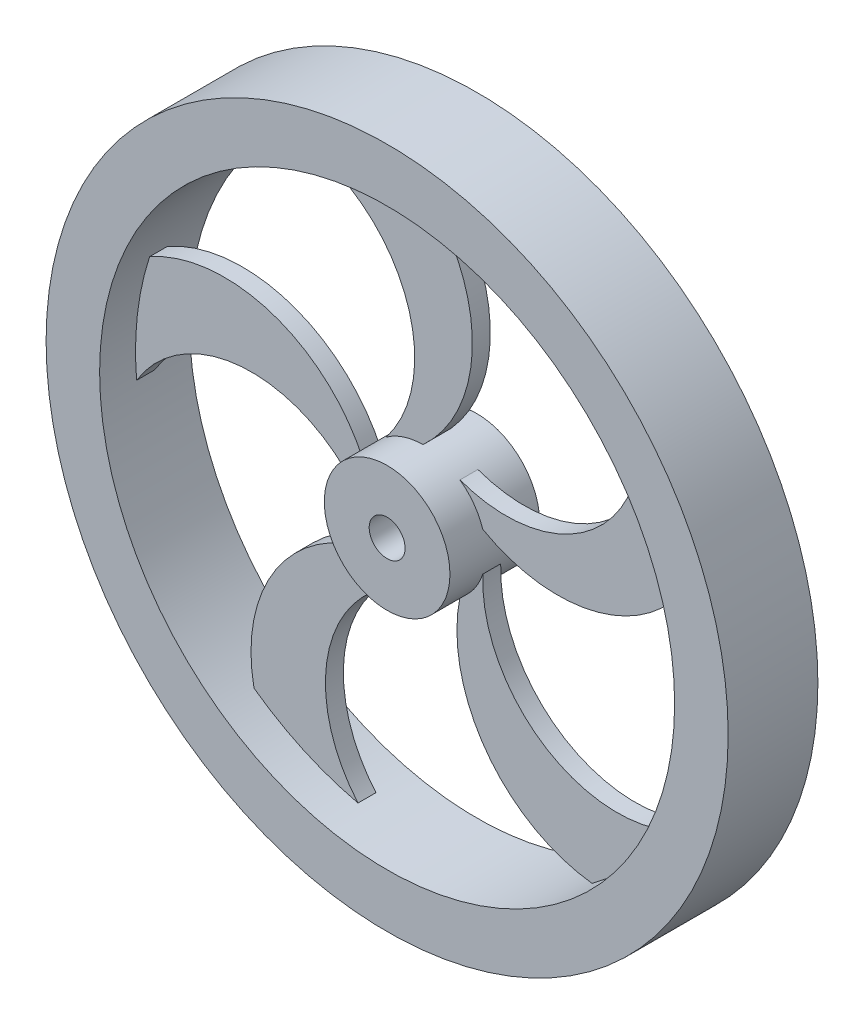
ISO-10303-21;
HEADER;
FILE_DESCRIPTION(('STEP AP214'),'2;1');
FILE_NAME('part.step','',(''),(''),'','','');
FILE_SCHEMA(('AUTOMOTIVE_DESIGN { 1 0 10303 214 1 1 1 1 }'));
ENDSEC;
DATA;
#1=APPLICATION_CONTEXT('core data for automotive mechanical design processes');
#2=APPLICATION_PROTOCOL_DEFINITION('international standard','automotive_design',2000,#1);
#3=PRODUCT_CONTEXT('',#1,'mechanical');
#4=PRODUCT('Part','Part','',(#3));
#5=PRODUCT_RELATED_PRODUCT_CATEGORY('part','',(#4));
#6=PRODUCT_DEFINITION_FORMATION('','',#4);
#7=PRODUCT_DEFINITION_CONTEXT('part definition',#1,'design');
#8=PRODUCT_DEFINITION('design','',#6,#7);
#9=PRODUCT_DEFINITION_SHAPE('','',#8);
#10=(LENGTH_UNIT() NAMED_UNIT(*) SI_UNIT(.MILLI.,.METRE.));
#11=(NAMED_UNIT(*) PLANE_ANGLE_UNIT() SI_UNIT($,.RADIAN.));
#12=(NAMED_UNIT(*) SI_UNIT($,.STERADIAN.) SOLID_ANGLE_UNIT());
#13=UNCERTAINTY_MEASURE_WITH_UNIT(LENGTH_MEASURE(1.E-05),#10,'distance_accuracy_value','');
#14=(GEOMETRIC_REPRESENTATION_CONTEXT(3) GLOBAL_UNCERTAINTY_ASSIGNED_CONTEXT((#13)) GLOBAL_UNIT_ASSIGNED_CONTEXT((#10,
#11,#12)) REPRESENTATION_CONTEXT('',''));
#15=CARTESIAN_POINT('',(0.,0.,0.));
#16=DIRECTION('',(0.,0.,1.));
#17=DIRECTION('',(1.,0.,0.));
#18=AXIS2_PLACEMENT_3D('',#15,#16,#17);
#19=CARTESIAN_POINT('',(0.,0.,5.));
#20=DIRECTION('',(0.,0.,-1.));
#21=DIRECTION('',(-1.,0.,0.));
#22=AXIS2_PLACEMENT_3D('',#19,#20,#21);
#23=CYLINDRICAL_SURFACE('',#22,32.0365194227107);
#24=CARTESIAN_POINT('',(0.,0.,1.));
#25=DIRECTION('',(0.,0.,1.));
#26=DIRECTION('',(1.,0.,0.));
#27=AXIS2_PLACEMENT_3D('',#24,#25,#26);
#28=CIRCLE('',#27,32.0365194227107);
#29=CARTESIAN_POINT('',(-18.830593651451,-25.9180886535959,1.));
#30=VERTEX_POINT('',#29);
#31=CARTESIAN_POINT('',(-7.24531851790362,-31.2064726666736,1.));
#32=VERTEX_POINT('',#31);
#33=EDGE_CURVE('E238',#30,#32,#28,.T.);
#34=ORIENTED_EDGE('',*,*,#33,.F.);
#35=DIRECTION('',(0.,0.,-1.));
#36=VECTOR('',#35,1.);
#37=CARTESIAN_POINT('',(-18.830593651451,-25.9180886535959,1.));
#38=LINE('',#37,#36);
#39=CARTESIAN_POINT('',(-18.830593651451,-25.9180886535959,-1.));
#40=VERTEX_POINT('',#39);
#41=EDGE_CURVE('E246',#30,#40,#38,.T.);
#42=ORIENTED_EDGE('',*,*,#41,.T.);
#43=CARTESIAN_POINT('',(0.,0.,-1.));
#44=DIRECTION('',(0.,0.,1.));
#45=DIRECTION('',(1.,0.,0.));
#46=AXIS2_PLACEMENT_3D('',#43,#44,#45);
#47=CIRCLE('',#46,32.0365194227107);
#48=CARTESIAN_POINT('',(-7.24531851790363,-31.2064726666736,-1.));
#49=VERTEX_POINT('',#48);
#50=EDGE_CURVE('E263',#40,#49,#47,.T.);
#51=ORIENTED_EDGE('',*,*,#50,.T.);
#52=DIRECTION('',(0.,0.,-1.));
#53=VECTOR('',#52,1.);
#54=CARTESIAN_POINT('',(-7.24531851790362,-31.2064726666736,1.));
#55=LINE('',#54,#53);
#56=EDGE_CURVE('E253',#32,#49,#55,.T.);
#57=ORIENTED_EDGE('',*,*,#56,.F.);
#58=EDGE_LOOP('',(#34,#42,#51,#57));
#59=FACE_BOUND('',#58,.T.);
#60=CARTESIAN_POINT('',(0.,0.,1.));
#61=DIRECTION('',(0.,0.,1.));
#62=DIRECTION('',(1.,0.,0.));
#63=AXIS2_PLACEMENT_3D('',#60,#61,#62);
#64=CIRCLE('',#63,32.0365194227107);
#65=CARTESIAN_POINT('',(18.8305936514506,-25.9180886535962,1.));
#66=VERTEX_POINT('',#65);
#67=CARTESIAN_POINT('',(27.4401926285348,-16.5340377775855,1.));
#68=VERTEX_POINT('',#67);
#69=EDGE_CURVE('E273',#66,#68,#64,.T.);
#70=ORIENTED_EDGE('',*,*,#69,.F.);
#71=DIRECTION('',(0.,0.,-1.));
#72=VECTOR('',#71,1.);
#73=CARTESIAN_POINT('',(18.8305936514506,-25.9180886535962,1.));
#74=LINE('',#73,#72);
#75=CARTESIAN_POINT('',(18.8305936514506,-25.9180886535962,-1.));
#76=VERTEX_POINT('',#75);
#77=EDGE_CURVE('E298',#66,#76,#74,.T.);
#78=ORIENTED_EDGE('',*,*,#77,.T.);
#79=CARTESIAN_POINT('',(0.,0.,-1.));
#80=DIRECTION('',(0.,0.,1.));
#81=DIRECTION('',(1.,0.,0.));
#82=AXIS2_PLACEMENT_3D('',#79,#80,#81);
#83=CIRCLE('',#82,32.0365194227107);
#84=CARTESIAN_POINT('',(27.4401926285348,-16.5340377775855,-1.));
#85=VERTEX_POINT('',#84);
#86=EDGE_CURVE('E284',#76,#85,#83,.T.);
#87=ORIENTED_EDGE('',*,*,#86,.T.);
#88=DIRECTION('',(0.,0.,-1.));
#89=VECTOR('',#88,1.);
#90=CARTESIAN_POINT('',(27.4401926285348,-16.5340377775855,1.));
#91=LINE('',#90,#89);
#92=EDGE_CURVE('E295',#68,#85,#91,.T.);
#93=ORIENTED_EDGE('',*,*,#92,.F.);
#94=EDGE_LOOP('',(#70,#78,#87,#93));
#95=FACE_BOUND('',#94,.T.);
#96=CARTESIAN_POINT('',(0.,0.,1.));
#97=DIRECTION('',(0.,0.,1.));
#98=DIRECTION('',(1.,0.,0.));
#99=AXIS2_PLACEMENT_3D('',#96,#97,#98);
#100=CIRCLE('',#99,32.0365194227107);
#101=CARTESIAN_POINT('',(30.4685405563853,9.89982894224061,1.));
#102=VERTEX_POINT('',#101);
#103=CARTESIAN_POINT('',(24.2042902201823,20.9878753488511,1.));
#104=VERTEX_POINT('',#103);
#105=EDGE_CURVE('E304',#102,#104,#100,.T.);
#106=ORIENTED_EDGE('',*,*,#105,.F.);
#107=DIRECTION('',(0.,0.,-1.));
#108=VECTOR('',#107,1.);
#109=CARTESIAN_POINT('',(30.4685405563853,9.89982894224061,1.));
#110=LINE('',#109,#108);
#111=CARTESIAN_POINT('',(30.4685405563853,9.89982894224061,-1.));
#112=VERTEX_POINT('',#111);
#113=EDGE_CURVE('E329',#102,#112,#110,.T.);
#114=ORIENTED_EDGE('',*,*,#113,.T.);
#115=CARTESIAN_POINT('',(0.,0.,-1.));
#116=DIRECTION('',(0.,0.,1.));
#117=DIRECTION('',(1.,0.,0.));
#118=AXIS2_PLACEMENT_3D('',#115,#116,#117);
#119=CIRCLE('',#118,32.0365194227107);
#120=CARTESIAN_POINT('',(24.2042902201823,20.987875348851,-1.));
#121=VERTEX_POINT('',#120);
#122=EDGE_CURVE('E315',#112,#121,#119,.T.);
#123=ORIENTED_EDGE('',*,*,#122,.T.);
#124=DIRECTION('',(0.,0.,-1.));
#125=VECTOR('',#124,1.);
#126=CARTESIAN_POINT('',(24.2042902201823,20.9878753488511,1.));
#127=LINE('',#126,#125);
#128=EDGE_CURVE('E326',#104,#121,#127,.T.);
#129=ORIENTED_EDGE('',*,*,#128,.F.);
#130=EDGE_LOOP('',(#106,#114,#123,#129));
#131=FACE_BOUND('',#130,.T.);
#132=CARTESIAN_POINT('',(0.,0.,1.));
#133=DIRECTION('',(0.,0.,1.));
#134=DIRECTION('',(1.,0.,0.));
#135=AXIS2_PLACEMENT_3D('',#132,#133,#134);
#136=CIRCLE('',#135,32.0365194227107);
#137=CARTESIAN_POINT('',(0.,32.0365194227108,1.));
#138=VERTEX_POINT('',#137);
#139=CARTESIAN_POINT('',(-12.4811185988956,29.5052580948214,1.));
#140=VERTEX_POINT('',#139);
#141=EDGE_CURVE('E335',#138,#140,#136,.T.);
#142=ORIENTED_EDGE('',*,*,#141,.F.);
#143=DIRECTION('',(0.,0.,-1.));
#144=VECTOR('',#143,1.);
#145=CARTESIAN_POINT('',(0.,32.0365194227108,1.));
#146=LINE('',#145,#144);
#147=CARTESIAN_POINT('',(0.,32.0365194227108,-1.));
#148=VERTEX_POINT('',#147);
#149=EDGE_CURVE('E360',#138,#148,#146,.T.);
#150=ORIENTED_EDGE('',*,*,#149,.T.);
#151=CARTESIAN_POINT('',(0.,0.,-1.));
#152=DIRECTION('',(0.,0.,1.));
#153=DIRECTION('',(1.,0.,0.));
#154=AXIS2_PLACEMENT_3D('',#151,#152,#153);
#155=CIRCLE('',#154,32.0365194227107);
#156=CARTESIAN_POINT('',(-12.4811185988956,29.5052580948214,-1.));
#157=VERTEX_POINT('',#156);
#158=EDGE_CURVE('E346',#148,#157,#155,.T.);
#159=ORIENTED_EDGE('',*,*,#158,.T.);
#160=DIRECTION('',(0.,0.,-1.));
#161=VECTOR('',#160,1.);
#162=CARTESIAN_POINT('',(-12.4811185988956,29.5052580948214,1.));
#163=LINE('',#162,#161);
#164=EDGE_CURVE('E357',#140,#157,#163,.T.);
#165=ORIENTED_EDGE('',*,*,#164,.F.);
#166=EDGE_LOOP('',(#142,#150,#159,#165));
#167=FACE_BOUND('',#166,.T.);
#168=CARTESIAN_POINT('',(0.,0.,1.));
#169=DIRECTION('',(0.,0.,1.));
#170=DIRECTION('',(1.,0.,0.));
#171=AXIS2_PLACEMENT_3D('',#168,#169,#170);
#172=CIRCLE('',#171,32.0365194227107);
#173=CARTESIAN_POINT('',(-30.4685405563852,9.89982894224105,1.));
#174=VERTEX_POINT('',#173);
#175=CARTESIAN_POINT('',(-31.9180457319183,-2.75262299941316,1.));
#176=VERTEX_POINT('',#175);
#177=EDGE_CURVE('E378',#174,#176,#172,.T.);
#178=ORIENTED_EDGE('',*,*,#177,.F.);
#179=DIRECTION('',(0.,0.,-1.));
#180=VECTOR('',#179,1.);
#181=CARTESIAN_POINT('',(-30.4685405563852,9.89982894224105,1.));
#182=LINE('',#181,#180);
#183=CARTESIAN_POINT('',(-30.4685405563852,9.89982894224105,-1.));
#184=VERTEX_POINT('',#183);
#185=EDGE_CURVE('E403',#174,#184,#182,.T.);
#186=ORIENTED_EDGE('',*,*,#185,.T.);
#187=CARTESIAN_POINT('',(0.,0.,-1.));
#188=DIRECTION('',(0.,0.,1.));
#189=DIRECTION('',(1.,0.,0.));
#190=AXIS2_PLACEMENT_3D('',#187,#188,#189);
#191=CIRCLE('',#190,32.0365194227107);
#192=CARTESIAN_POINT('',(-31.9180457319182,-2.75262299941315,-1.));
#193=VERTEX_POINT('',#192);
#194=EDGE_CURVE('E389',#184,#193,#191,.T.);
#195=ORIENTED_EDGE('',*,*,#194,.T.);
#196=DIRECTION('',(0.,0.,-1.));
#197=VECTOR('',#196,1.);
#198=CARTESIAN_POINT('',(-31.9180457319183,-2.75262299941316,1.));
#199=LINE('',#198,#197);
#200=EDGE_CURVE('E400',#176,#193,#199,.T.);
#201=ORIENTED_EDGE('',*,*,#200,.F.);
#202=EDGE_LOOP('',(#178,#186,#195,#201));
#203=FACE_BOUND('',#202,.T.);
#204=CARTESIAN_POINT('',(0.,0.,5.));
#205=DIRECTION('',(0.,0.,1.));
#206=DIRECTION('',(1.,0.,0.));
#207=AXIS2_PLACEMENT_3D('',#204,#205,#206);
#208=CIRCLE('',#207,32.0365194227107);
#209=CARTESIAN_POINT('',(32.0365194227107,0.,5.));
#210=VERTEX_POINT('',#209);
#211=EDGE_CURVE('E103',#210,#210,#208,.T.);
#212=ORIENTED_EDGE('',*,*,#211,.T.);
#213=EDGE_LOOP('',(#212));
#214=FACE_BOUND('',#213,.T.);
#215=CARTESIAN_POINT('',(0.,0.,-5.));
#216=DIRECTION('',(0.,0.,1.));
#217=DIRECTION('',(1.,0.,0.));
#218=AXIS2_PLACEMENT_3D('',#215,#216,#217);
#219=CIRCLE('',#218,32.0365194227107);
#220=CARTESIAN_POINT('',(32.0365194227107,0.,-5.));
#221=VERTEX_POINT('',#220);
#222=EDGE_CURVE('E406',#221,#221,#219,.T.);
#223=ORIENTED_EDGE('',*,*,#222,.F.);
#224=EDGE_LOOP('',(#223));
#225=FACE_BOUND('',#224,.T.);
#226=ADVANCED_FACE('F95',(#59,#95,#131,#167,#203,#214,#225),#23,.F.);
#227=CARTESIAN_POINT('',(0.,0.,5.));
#228=DIRECTION('',(0.,0.,-1.));
#229=DIRECTION('',(-1.,0.,0.));
#230=AXIS2_PLACEMENT_3D('',#227,#228,#229);
#231=CYLINDRICAL_SURFACE('',#230,38.);
#232=CARTESIAN_POINT('',(0.,0.,5.));
#233=DIRECTION('',(0.,0.,1.));
#234=DIRECTION('',(1.,0.,0.));
#235=AXIS2_PLACEMENT_3D('',#232,#233,#234);
#236=CIRCLE('',#235,38.);
#237=CARTESIAN_POINT('',(38.,0.,5.));
#238=VERTEX_POINT('',#237);
#239=EDGE_CURVE('E12',#238,#238,#236,.T.);
#240=ORIENTED_EDGE('',*,*,#239,.F.);
#241=EDGE_LOOP('',(#240));
#242=FACE_BOUND('',#241,.T.);
#243=CARTESIAN_POINT('',(0.,0.,-5.));
#244=DIRECTION('',(0.,0.,1.));
#245=DIRECTION('',(1.,0.,0.));
#246=AXIS2_PLACEMENT_3D('',#243,#244,#245);
#247=CIRCLE('',#246,38.);
#248=CARTESIAN_POINT('',(38.,0.,-5.));
#249=VERTEX_POINT('',#248);
#250=EDGE_CURVE('E98',#249,#249,#247,.T.);
#251=ORIENTED_EDGE('',*,*,#250,.T.);
#252=EDGE_LOOP('',(#251));
#253=FACE_BOUND('',#252,.T.);
#254=ADVANCED_FACE('F414',(#242,#253),#231,.T.);
#255=CARTESIAN_POINT('',(0.,0.,5.));
#256=DIRECTION('',(0.,0.,1.));
#257=DIRECTION('',(1.,0.,0.));
#258=AXIS2_PLACEMENT_3D('',#255,#256,#257);
#259=PLANE('',#258);
#260=ORIENTED_EDGE('',*,*,#211,.F.);
#261=EDGE_LOOP('',(#260));
#262=FACE_BOUND('',#261,.T.);
#263=ORIENTED_EDGE('',*,*,#239,.T.);
#264=EDGE_LOOP('',(#263));
#265=FACE_BOUND('',#264,.T.);
#266=ADVANCED_FACE('F419',(#262,#265),#259,.T.);
#267=CARTESIAN_POINT('',(0.,0.,-5.));
#268=DIRECTION('',(0.,0.,1.));
#269=DIRECTION('',(1.,0.,0.));
#270=AXIS2_PLACEMENT_3D('',#267,#268,#269);
#271=PLANE('',#270);
#272=ORIENTED_EDGE('',*,*,#222,.T.);
#273=EDGE_LOOP('',(#272));
#274=FACE_BOUND('',#273,.T.);
#275=ORIENTED_EDGE('',*,*,#250,.F.);
#276=EDGE_LOOP('',(#275));
#277=FACE_BOUND('',#276,.T.);
#278=ADVANCED_FACE('F416',(#274,#277),#271,.F.);
#279=CARTESIAN_POINT('',(-22.1172435357094,-4.90746108910673,1.));
#280=DIRECTION('',(0.,0.,-1.));
#281=DIRECTION('',(-1.,0.,0.));
#282=AXIS2_PLACEMENT_3D('',#279,#280,#281);
#283=CYLINDRICAL_SURFACE('',#282,17.);
#284=CARTESIAN_POINT('',(-22.1172435357094,-4.90746108910673,-1.));
#285=DIRECTION('',(0.,0.,1.));
#286=DIRECTION('',(1.,0.,0.));
#287=AXIS2_PLACEMENT_3D('',#284,#285,#286);
#288=CIRCLE('',#287,17.);
#289=CARTESIAN_POINT('',(-6.65739561406605,2.1631189606247,-1.));
#290=VERTEX_POINT('',#289);
#291=EDGE_CURVE('E371',#290,#184,#288,.T.);
#292=ORIENTED_EDGE('',*,*,#291,.T.);
#293=ORIENTED_EDGE('',*,*,#185,.F.);
#294=CARTESIAN_POINT('',(-22.1172435357094,-4.90746108910673,1.));
#295=DIRECTION('',(0.,0.,1.));
#296=DIRECTION('',(1.,0.,0.));
#297=AXIS2_PLACEMENT_3D('',#294,#295,#296);
#298=CIRCLE('',#297,17.);
#299=CARTESIAN_POINT('',(-6.65739561406605,2.1631189606247,1.));
#300=VERTEX_POINT('',#299);
#301=EDGE_CURVE('E376',#300,#174,#298,.T.);
#302=ORIENTED_EDGE('',*,*,#301,.F.);
#303=DIRECTION('',(0.,0.,-1.));
#304=VECTOR('',#303,1.);
#305=CARTESIAN_POINT('',(-6.65739561406605,2.1631189606247,1.));
#306=LINE('',#305,#304);
#307=EDGE_CURVE('E386',#300,#290,#306,.T.);
#308=ORIENTED_EDGE('',*,*,#307,.T.);
#309=EDGE_LOOP('',(#292,#293,#302,#308));
#310=FACE_BOUND('',#309,.T.);
#311=ADVANCED_FACE('F418',(#310),#283,.T.);
#312=CARTESIAN_POINT('',(-19.0982128463832,-10.5405549962242,1.));
#313=DIRECTION('',(0.,0.,-1.));
#314=DIRECTION('',(-1.,0.,0.));
#315=AXIS2_PLACEMENT_3D('',#312,#313,#314);
#316=CYLINDRICAL_SURFACE('',#315,15.);
#317=CARTESIAN_POINT('',(-19.0982128463832,-10.5405549962242,-1.));
#318=DIRECTION('',(0.,0.,1.));
#319=DIRECTION('',(1.,0.,0.));
#320=AXIS2_PLACEMENT_3D('',#317,#318,#319);
#321=CIRCLE('',#320,15.);
#322=CARTESIAN_POINT('',(-6.65906286575451,-2.15798094290227,-1.));
#323=VERTEX_POINT('',#322);
#324=EDGE_CURVE('E392',#323,#193,#321,.T.);
#325=ORIENTED_EDGE('',*,*,#324,.F.);
#326=DIRECTION('',(0.,0.,-1.));
#327=VECTOR('',#326,1.);
#328=CARTESIAN_POINT('',(-6.65906286575451,-2.15798094290227,1.));
#329=LINE('',#328,#327);
#330=CARTESIAN_POINT('',(-6.65906286575451,-2.15798094290227,1.));
#331=VERTEX_POINT('',#330);
#332=EDGE_CURVE('E398',#331,#323,#329,.T.);
#333=ORIENTED_EDGE('',*,*,#332,.F.);
#334=CARTESIAN_POINT('',(-19.0982128463832,-10.5405549962242,1.));
#335=DIRECTION('',(0.,0.,1.));
#336=DIRECTION('',(1.,0.,0.));
#337=AXIS2_PLACEMENT_3D('',#334,#335,#336);
#338=CIRCLE('',#337,15.);
#339=EDGE_CURVE('E381',#331,#176,#338,.T.);
#340=ORIENTED_EDGE('',*,*,#339,.T.);
#341=ORIENTED_EDGE('',*,*,#200,.T.);
#342=EDGE_LOOP('',(#325,#333,#340,#341));
#343=FACE_BOUND('',#342,.T.);
#344=ADVANCED_FACE('F425',(#343),#316,.F.);
#345=CARTESIAN_POINT('',(0.,0.,1.));
#346=DIRECTION('',(0.,0.,1.));
#347=DIRECTION('',(1.,0.,0.));
#348=AXIS2_PLACEMENT_3D('',#345,#346,#347);
#349=PLANE('',#348);
#350=ORIENTED_EDGE('',*,*,#301,.T.);
#351=ORIENTED_EDGE('',*,*,#177,.T.);
#352=ORIENTED_EDGE('',*,*,#339,.F.);
#353=CARTESIAN_POINT('',(0.,0.,1.));
#354=DIRECTION('',(0.,0.,1.));
#355=DIRECTION('',(1.,0.,0.));
#356=AXIS2_PLACEMENT_3D('',#353,#354,#355);
#357=CIRCLE('',#356,7.);
#358=EDGE_CURVE('E384',#300,#331,#357,.T.);
#359=ORIENTED_EDGE('',*,*,#358,.F.);
#360=EDGE_LOOP('',(#350,#351,#352,#359));
#361=FACE_BOUND('',#360,.T.);
#362=ADVANCED_FACE('F468',(#361),#349,.T.);
#363=CARTESIAN_POINT('',(0.,0.,-1.));
#364=DIRECTION('',(0.,0.,1.));
#365=DIRECTION('',(1.,0.,0.));
#366=AXIS2_PLACEMENT_3D('',#363,#364,#365);
#367=PLANE('',#366);
#368=ORIENTED_EDGE('',*,*,#291,.F.);
#369=CARTESIAN_POINT('',(0.,0.,-1.));
#370=DIRECTION('',(0.,0.,1.));
#371=DIRECTION('',(1.,0.,0.));
#372=AXIS2_PLACEMENT_3D('',#369,#370,#371);
#373=CIRCLE('',#372,7.);
#374=EDGE_CURVE('E379',#290,#323,#373,.T.);
#375=ORIENTED_EDGE('',*,*,#374,.T.);
#376=ORIENTED_EDGE('',*,*,#324,.T.);
#377=ORIENTED_EDGE('',*,*,#194,.F.);
#378=EDGE_LOOP('',(#368,#375,#376,#377));
#379=FACE_BOUND('',#378,.T.);
#380=ADVANCED_FACE('F478',(#379),#367,.F.);
#381=CARTESIAN_POINT('',(0.,0.,5.));
#382=DIRECTION('',(0.,0.,-1.));
#383=DIRECTION('',(-1.,0.,0.));
#384=AXIS2_PLACEMENT_3D('',#381,#382,#383);
#385=CYLINDRICAL_SURFACE('',#384,2.);
#386=CARTESIAN_POINT('',(0.,0.,5.));
#387=DIRECTION('',(0.,0.,1.));
#388=DIRECTION('',(1.,0.,0.));
#389=AXIS2_PLACEMENT_3D('',#386,#387,#388);
#390=CIRCLE('',#389,2.);
#391=CARTESIAN_POINT('',(2.,0.,5.));
#392=VERTEX_POINT('',#391);
#393=EDGE_CURVE('E364',#392,#392,#390,.T.);
#394=ORIENTED_EDGE('',*,*,#393,.T.);
#395=EDGE_LOOP('',(#394));
#396=FACE_BOUND('',#395,.T.);
#397=CARTESIAN_POINT('',(0.,0.,-5.));
#398=DIRECTION('',(0.,0.,1.));
#399=DIRECTION('',(1.,0.,0.));
#400=AXIS2_PLACEMENT_3D('',#397,#398,#399);
#401=CIRCLE('',#400,2.);
#402=CARTESIAN_POINT('',(2.,0.,-5.));
#403=VERTEX_POINT('',#402);
#404=EDGE_CURVE('E363',#403,#403,#401,.T.);
#405=ORIENTED_EDGE('',*,*,#404,.F.);
#406=EDGE_LOOP('',(#405));
#407=FACE_BOUND('',#406,.T.);
#408=ADVANCED_FACE('F488',(#396,#407),#385,.F.);
#409=CARTESIAN_POINT('',(0.,0.,5.));
#410=DIRECTION('',(0.,0.,-1.));
#411=DIRECTION('',(-1.,0.,0.));
#412=AXIS2_PLACEMENT_3D('',#409,#410,#411);
#413=CYLINDRICAL_SURFACE('',#412,7.);
#414=DIRECTION('',(0.,0.,-1.));
#415=VECTOR('',#414,1.);
#416=CARTESIAN_POINT('',(-4.11449676604737,-5.66311896062459,1.));
#417=LINE('',#416,#415);
#418=CARTESIAN_POINT('',(-4.11449676604737,-5.6631189606246,1.));
#419=VERTEX_POINT('',#418);
#420=CARTESIAN_POINT('',(-4.11449676604737,-5.6631189606246,-1.));
#421=VERTEX_POINT('',#420);
#422=EDGE_CURVE('E119',#419,#421,#417,.T.);
#423=ORIENTED_EDGE('',*,*,#422,.F.);
#424=CARTESIAN_POINT('',(0.,0.,1.));
#425=DIRECTION('',(0.,0.,1.));
#426=DIRECTION('',(1.,0.,0.));
#427=AXIS2_PLACEMENT_3D('',#424,#425,#426);
#428=CIRCLE('',#427,7.);
#429=CARTESIAN_POINT('',(-0.00540175434129726,-6.99999791578898,1.));
#430=VERTEX_POINT('',#429);
#431=EDGE_CURVE('E240',#419,#430,#428,.T.);
#432=ORIENTED_EDGE('',*,*,#431,.T.);
#433=DIRECTION('',(0.,0.,-1.));
#434=VECTOR('',#433,1.);
#435=CARTESIAN_POINT('',(-0.00540175434129856,-6.99999791578898,1.));
#436=LINE('',#435,#434);
#437=CARTESIAN_POINT('',(-0.00540175434129856,-6.99999791578898,-1.));
#438=VERTEX_POINT('',#437);
#439=EDGE_CURVE('E268',#430,#438,#436,.T.);
#440=ORIENTED_EDGE('',*,*,#439,.T.);
#441=CARTESIAN_POINT('',(0.,0.,-1.));
#442=DIRECTION('',(0.,0.,1.));
#443=DIRECTION('',(1.,0.,0.));
#444=AXIS2_PLACEMENT_3D('',#441,#442,#443);
#445=CIRCLE('',#444,7.);
#446=EDGE_CURVE('E242',#421,#438,#445,.T.);
#447=ORIENTED_EDGE('',*,*,#446,.F.);
#448=EDGE_LOOP('',(#423,#432,#440,#447));
#449=FACE_BOUND('',#448,.T.);
#450=DIRECTION('',(0.,0.,-1.));
#451=VECTOR('',#450,1.);
#452=CARTESIAN_POINT('',(4.11449676604728,-5.66311896062466,1.));
#453=LINE('',#452,#451);
#454=CARTESIAN_POINT('',(4.11449676604728,-5.66311896062466,1.));
#455=VERTEX_POINT('',#454);
#456=CARTESIAN_POINT('',(4.11449676604728,-5.66311896062464,-1.));
#457=VERTEX_POINT('',#456);
#458=EDGE_CURVE('E281',#455,#457,#453,.T.);
#459=ORIENTED_EDGE('',*,*,#458,.F.);
#460=CARTESIAN_POINT('',(0.,0.,1.));
#461=DIRECTION('',(0.,0.,1.));
#462=DIRECTION('',(1.,0.,0.));
#463=AXIS2_PLACEMENT_3D('',#460,#461,#462);
#464=CIRCLE('',#463,7.);
#465=CARTESIAN_POINT('',(6.65572439797271,-2.1682556902337,1.));
#466=VERTEX_POINT('',#465);
#467=EDGE_CURVE('E279',#455,#466,#464,.T.);
#468=ORIENTED_EDGE('',*,*,#467,.T.);
#469=DIRECTION('',(0.,0.,-1.));
#470=VECTOR('',#469,1.);
#471=CARTESIAN_POINT('',(6.65572439797271,-2.1682556902337,1.));
#472=LINE('',#471,#470);
#473=CARTESIAN_POINT('',(6.65572439797271,-2.1682556902337,-1.));
#474=VERTEX_POINT('',#473);
#475=EDGE_CURVE('E293',#466,#474,#472,.T.);
#476=ORIENTED_EDGE('',*,*,#475,.T.);
#477=CARTESIAN_POINT('',(0.,0.,-1.));
#478=DIRECTION('',(0.,0.,1.));
#479=DIRECTION('',(1.,0.,0.));
#480=AXIS2_PLACEMENT_3D('',#477,#478,#479);
#481=CIRCLE('',#480,7.);
#482=EDGE_CURVE('E274',#457,#474,#481,.T.);
#483=ORIENTED_EDGE('',*,*,#482,.F.);
#484=EDGE_LOOP('',(#459,#468,#476,#483));
#485=FACE_BOUND('',#484,.T.);
#486=DIRECTION('',(0.,0.,-1.));
#487=VECTOR('',#486,1.);
#488=CARTESIAN_POINT('',(6.65739561406608,2.16311896062461,1.));
#489=LINE('',#488,#487);
#490=CARTESIAN_POINT('',(6.65739561406609,2.1631189606246,1.));
#491=VERTEX_POINT('',#490);
#492=CARTESIAN_POINT('',(6.65739561406609,2.16311896062461,-1.));
#493=VERTEX_POINT('',#492);
#494=EDGE_CURVE('E312',#491,#493,#489,.T.);
#495=ORIENTED_EDGE('',*,*,#494,.F.);
#496=CARTESIAN_POINT('',(0.,0.,1.));
#497=DIRECTION('',(0.,0.,1.));
#498=DIRECTION('',(1.,0.,0.));
#499=AXIS2_PLACEMENT_3D('',#496,#497,#498);
#500=CIRCLE('',#499,7.);
#501=CARTESIAN_POINT('',(4.11886565204033,5.6599422029242,1.));
#502=VERTEX_POINT('',#501);
#503=EDGE_CURVE('E310',#491,#502,#500,.T.);
#504=ORIENTED_EDGE('',*,*,#503,.T.);
#505=DIRECTION('',(0.,0.,-1.));
#506=VECTOR('',#505,1.);
#507=CARTESIAN_POINT('',(4.11886565204033,5.6599422029242,1.));
#508=LINE('',#507,#506);
#509=CARTESIAN_POINT('',(4.11886565204033,5.6599422029242,-1.));
#510=VERTEX_POINT('',#509);
#511=EDGE_CURVE('E324',#502,#510,#508,.T.);
#512=ORIENTED_EDGE('',*,*,#511,.T.);
#513=CARTESIAN_POINT('',(0.,0.,-1.));
#514=DIRECTION('',(0.,0.,1.));
#515=DIRECTION('',(1.,0.,0.));
#516=AXIS2_PLACEMENT_3D('',#513,#514,#515);
#517=CIRCLE('',#516,7.);
#518=EDGE_CURVE('E305',#493,#510,#517,.T.);
#519=ORIENTED_EDGE('',*,*,#518,.F.);
#520=EDGE_LOOP('',(#495,#504,#512,#519));
#521=FACE_BOUND('',#520,.T.);
#522=DIRECTION('',(0.,0.,-1.));
#523=VECTOR('',#522,1.);
#524=CARTESIAN_POINT('',(0.,7.,1.));
#525=LINE('',#524,#523);
#526=CARTESIAN_POINT('',(0.,7.,1.));
#527=VERTEX_POINT('',#526);
#528=CARTESIAN_POINT('',(0.,6.99999999999999,-1.));
#529=VERTEX_POINT('',#528);
#530=EDGE_CURVE('E343',#527,#529,#525,.T.);
#531=ORIENTED_EDGE('',*,*,#530,.F.);
#532=CARTESIAN_POINT('',(0.,0.,1.));
#533=DIRECTION('',(0.,0.,1.));
#534=DIRECTION('',(1.,0.,0.));
#535=AXIS2_PLACEMENT_3D('',#532,#533,#534);
#536=CIRCLE('',#535,7.);
#537=CARTESIAN_POINT('',(-4.11012542991731,5.66629234600078,1.));
#538=VERTEX_POINT('',#537);
#539=EDGE_CURVE('E341',#527,#538,#536,.T.);
#540=ORIENTED_EDGE('',*,*,#539,.T.);
#541=DIRECTION('',(0.,0.,-1.));
#542=VECTOR('',#541,1.);
#543=CARTESIAN_POINT('',(-4.11012542991731,5.66629234600078,1.));
#544=LINE('',#543,#542);
#545=CARTESIAN_POINT('',(-4.11012542991731,5.66629234600078,-1.));
#546=VERTEX_POINT('',#545);
#547=EDGE_CURVE('E355',#538,#546,#544,.T.);
#548=ORIENTED_EDGE('',*,*,#547,.T.);
#549=CARTESIAN_POINT('',(0.,0.,-1.));
#550=DIRECTION('',(0.,0.,1.));
#551=DIRECTION('',(1.,0.,0.));
#552=AXIS2_PLACEMENT_3D('',#549,#550,#551);
#553=CIRCLE('',#552,7.);
#554=EDGE_CURVE('E336',#529,#546,#553,.T.);
#555=ORIENTED_EDGE('',*,*,#554,.F.);
#556=EDGE_LOOP('',(#531,#540,#548,#555));
#557=FACE_BOUND('',#556,.T.);
#558=ORIENTED_EDGE('',*,*,#358,.T.);
#559=ORIENTED_EDGE('',*,*,#332,.T.);
#560=ORIENTED_EDGE('',*,*,#374,.F.);
#561=ORIENTED_EDGE('',*,*,#307,.F.);
#562=EDGE_LOOP('',(#558,#559,#560,#561));
#563=FACE_BOUND('',#562,.T.);
#564=CARTESIAN_POINT('',(0.,0.,5.));
#565=DIRECTION('',(0.,0.,1.));
#566=DIRECTION('',(1.,0.,0.));
#567=AXIS2_PLACEMENT_3D('',#564,#565,#566);
#568=CIRCLE('',#567,7.);
#569=CARTESIAN_POINT('',(7.,0.,5.));
#570=VERTEX_POINT('',#569);
#571=EDGE_CURVE('E367',#570,#570,#568,.T.);
#572=ORIENTED_EDGE('',*,*,#571,.F.);
#573=EDGE_LOOP('',(#572));
#574=FACE_BOUND('',#573,.T.);
#575=CARTESIAN_POINT('',(0.,0.,-5.));
#576=DIRECTION('',(0.,0.,1.));
#577=DIRECTION('',(1.,0.,0.));
#578=AXIS2_PLACEMENT_3D('',#575,#576,#577);
#579=CIRCLE('',#578,7.);
#580=CARTESIAN_POINT('',(7.,0.,-5.));
#581=VERTEX_POINT('',#580);
#582=EDGE_CURVE('E368',#581,#581,#579,.T.);
#583=ORIENTED_EDGE('',*,*,#582,.T.);
#584=EDGE_LOOP('',(#583));
#585=FACE_BOUND('',#584,.T.);
#586=ADVANCED_FACE('F498',(#449,#485,#521,#557,#563,#574,#585),#413,.T.);
#587=CARTESIAN_POINT('',(0.,0.,5.));
#588=DIRECTION('',(0.,0.,1.));
#589=DIRECTION('',(1.,0.,0.));
#590=AXIS2_PLACEMENT_3D('',#587,#588,#589);
#591=PLANE('',#590);
#592=ORIENTED_EDGE('',*,*,#393,.F.);
#593=EDGE_LOOP('',(#592));
#594=FACE_BOUND('',#593,.T.);
#595=ORIENTED_EDGE('',*,*,#571,.T.);
#596=EDGE_LOOP('',(#595));
#597=FACE_BOUND('',#596,.T.);
#598=ADVANCED_FACE('F508',(#594,#597),#591,.T.);
#599=CARTESIAN_POINT('',(0.,0.,-5.));
#600=DIRECTION('',(0.,0.,1.));
#601=DIRECTION('',(1.,0.,0.));
#602=AXIS2_PLACEMENT_3D('',#599,#600,#601);
#603=PLANE('',#602);
#604=ORIENTED_EDGE('',*,*,#404,.T.);
#605=EDGE_LOOP('',(#604));
#606=FACE_BOUND('',#605,.T.);
#607=ORIENTED_EDGE('',*,*,#582,.F.);
#608=EDGE_LOOP('',(#607));
#609=FACE_BOUND('',#608,.T.);
#610=ADVANCED_FACE('F517',(#606,#609),#603,.F.);
#611=CARTESIAN_POINT('',(-11.5018769685237,19.5182597113554,1.));
#612=DIRECTION('',(0.,0.,-1.));
#613=DIRECTION('',(-1.,0.,0.));
#614=AXIS2_PLACEMENT_3D('',#611,#612,#613);
#615=CYLINDRICAL_SURFACE('',#614,17.);
#616=CARTESIAN_POINT('',(-11.5018769685237,19.5182597113554,-1.));
#617=DIRECTION('',(0.,0.,1.));
#618=DIRECTION('',(1.,0.,0.));
#619=AXIS2_PLACEMENT_3D('',#616,#617,#618);
#620=CIRCLE('',#619,17.);
#621=EDGE_CURVE('E332',#529,#148,#620,.T.);
#622=ORIENTED_EDGE('',*,*,#621,.T.);
#623=ORIENTED_EDGE('',*,*,#149,.F.);
#624=CARTESIAN_POINT('',(-11.5018769685237,19.5182597113554,1.));
#625=DIRECTION('',(0.,0.,1.));
#626=DIRECTION('',(1.,0.,0.));
#627=AXIS2_PLACEMENT_3D('',#624,#625,#626);
#628=CIRCLE('',#627,17.);
#629=EDGE_CURVE('E333',#527,#138,#628,.T.);
#630=ORIENTED_EDGE('',*,*,#629,.F.);
#631=ORIENTED_EDGE('',*,*,#530,.T.);
#632=EDGE_LOOP('',(#622,#623,#630,#631));
#633=FACE_BOUND('',#632,.T.);
#634=ADVANCED_FACE('F526',(#633),#615,.T.);
#635=CARTESIAN_POINT('',(-15.926335846249,14.9062691531673,1.));
#636=DIRECTION('',(0.,0.,-1.));
#637=DIRECTION('',(-1.,0.,0.));
#638=AXIS2_PLACEMENT_3D('',#635,#636,#637);
#639=CYLINDRICAL_SURFACE('',#638,15.);
#640=CARTESIAN_POINT('',(-15.926335846249,14.9062691531673,-1.));
#641=DIRECTION('',(0.,0.,1.));
#642=DIRECTION('',(1.,0.,0.));
#643=AXIS2_PLACEMENT_3D('',#640,#641,#642);
#644=CIRCLE('',#643,15.);
#645=EDGE_CURVE('E349',#546,#157,#644,.T.);
#646=ORIENTED_EDGE('',*,*,#645,.F.);
#647=ORIENTED_EDGE('',*,*,#547,.F.);
#648=CARTESIAN_POINT('',(-15.926335846249,14.9062691531673,1.));
#649=DIRECTION('',(0.,0.,1.));
#650=DIRECTION('',(1.,0.,0.));
#651=AXIS2_PLACEMENT_3D('',#648,#649,#650);
#652=CIRCLE('',#651,15.);
#653=EDGE_CURVE('E338',#538,#140,#652,.T.);
#654=ORIENTED_EDGE('',*,*,#653,.T.);
#655=ORIENTED_EDGE('',*,*,#164,.T.);
#656=EDGE_LOOP('',(#646,#647,#654,#655));
#657=FACE_BOUND('',#656,.T.);
#658=ADVANCED_FACE('F535',(#657),#639,.F.);
#659=CARTESIAN_POINT('',(0.,0.,1.));
#660=DIRECTION('',(0.,0.,1.));
#661=DIRECTION('',(1.,0.,0.));
#662=AXIS2_PLACEMENT_3D('',#659,#660,#661);
#663=PLANE('',#662);
#664=ORIENTED_EDGE('',*,*,#629,.T.);
#665=ORIENTED_EDGE('',*,*,#141,.T.);
#666=ORIENTED_EDGE('',*,*,#653,.F.);
#667=ORIENTED_EDGE('',*,*,#539,.F.);
#668=EDGE_LOOP('',(#664,#665,#666,#667));
#669=FACE_BOUND('',#668,.T.);
#670=ADVANCED_FACE('F545',(#669),#663,.T.);
#671=CARTESIAN_POINT('',(0.,0.,-1.));
#672=DIRECTION('',(0.,0.,1.));
#673=DIRECTION('',(1.,0.,0.));
#674=AXIS2_PLACEMENT_3D('',#671,#672,#673);
#675=PLANE('',#674);
#676=ORIENTED_EDGE('',*,*,#621,.F.);
#677=ORIENTED_EDGE('',*,*,#554,.T.);
#678=ORIENTED_EDGE('',*,*,#645,.T.);
#679=ORIENTED_EDGE('',*,*,#158,.F.);
#680=EDGE_LOOP('',(#676,#677,#678,#679));
#681=FACE_BOUND('',#680,.T.);
#682=ADVANCED_FACE('F555',(#681),#675,.F.);
#683=CARTESIAN_POINT('',(15.0086926347421,16.9704089919723,1.));
#684=DIRECTION('',(0.,0.,-1.));
#685=DIRECTION('',(-1.,0.,0.));
#686=AXIS2_PLACEMENT_3D('',#683,#684,#685);
#687=CYLINDRICAL_SURFACE('',#686,17.);
#688=CARTESIAN_POINT('',(15.0086926347421,16.9704089919723,-1.));
#689=DIRECTION('',(0.,0.,1.));
#690=DIRECTION('',(1.,0.,0.));
#691=AXIS2_PLACEMENT_3D('',#688,#689,#690);
#692=CIRCLE('',#691,17.);
#693=EDGE_CURVE('E301',#493,#112,#692,.T.);
#694=ORIENTED_EDGE('',*,*,#693,.T.);
#695=ORIENTED_EDGE('',*,*,#113,.F.);
#696=CARTESIAN_POINT('',(15.0086926347421,16.9704089919723,1.));
#697=DIRECTION('',(0.,0.,1.));
#698=DIRECTION('',(1.,0.,0.));
#699=AXIS2_PLACEMENT_3D('',#696,#697,#698);
#700=CIRCLE('',#699,17.);
#701=EDGE_CURVE('E302',#491,#102,#700,.T.);
#702=ORIENTED_EDGE('',*,*,#701,.F.);
#703=ORIENTED_EDGE('',*,*,#494,.T.);
#704=EDGE_LOOP('',(#694,#695,#702,#703));
#705=FACE_BOUND('',#704,.T.);
#706=ADVANCED_FACE('F565',(#705),#687,.T.);
#707=CARTESIAN_POINT('',(9.25519597715543,19.7531359783359,1.));
#708=DIRECTION('',(0.,0.,-1.));
#709=DIRECTION('',(-1.,0.,0.));
#710=AXIS2_PLACEMENT_3D('',#707,#708,#709);
#711=CYLINDRICAL_SURFACE('',#710,15.);
#712=CARTESIAN_POINT('',(9.25519597715543,19.7531359783359,-1.));
#713=DIRECTION('',(0.,0.,1.));
#714=DIRECTION('',(1.,0.,0.));
#715=AXIS2_PLACEMENT_3D('',#712,#713,#714);
#716=CIRCLE('',#715,15.);
#717=EDGE_CURVE('E318',#510,#121,#716,.T.);
#718=ORIENTED_EDGE('',*,*,#717,.F.);
#719=ORIENTED_EDGE('',*,*,#511,.F.);
#720=CARTESIAN_POINT('',(9.25519597715543,19.7531359783359,1.));
#721=DIRECTION('',(0.,0.,1.));
#722=DIRECTION('',(1.,0.,0.));
#723=AXIS2_PLACEMENT_3D('',#720,#721,#722);
#724=CIRCLE('',#723,15.);
#725=EDGE_CURVE('E307',#502,#104,#724,.T.);
#726=ORIENTED_EDGE('',*,*,#725,.T.);
#727=ORIENTED_EDGE('',*,*,#128,.T.);
#728=EDGE_LOOP('',(#718,#719,#726,#727));
#729=FACE_BOUND('',#728,.T.);
#730=ADVANCED_FACE('F575',(#729),#711,.F.);
#731=CARTESIAN_POINT('',(0.,0.,1.));
#732=DIRECTION('',(0.,0.,1.));
#733=DIRECTION('',(1.,0.,0.));
#734=AXIS2_PLACEMENT_3D('',#731,#732,#733);
#735=PLANE('',#734);
#736=ORIENTED_EDGE('',*,*,#701,.T.);
#737=ORIENTED_EDGE('',*,*,#105,.T.);
#738=ORIENTED_EDGE('',*,*,#725,.F.);
#739=ORIENTED_EDGE('',*,*,#503,.F.);
#740=EDGE_LOOP('',(#736,#737,#738,#739));
#741=FACE_BOUND('',#740,.T.);
#742=ADVANCED_FACE('F585',(#741),#735,.T.);
#743=CARTESIAN_POINT('',(0.,0.,-1.));
#744=DIRECTION('',(0.,0.,1.));
#745=DIRECTION('',(1.,0.,0.));
#746=AXIS2_PLACEMENT_3D('',#743,#744,#745);
#747=PLANE('',#746);
#748=ORIENTED_EDGE('',*,*,#693,.F.);
#749=ORIENTED_EDGE('',*,*,#518,.T.);
#750=ORIENTED_EDGE('',*,*,#717,.T.);
#751=ORIENTED_EDGE('',*,*,#122,.F.);
#752=EDGE_LOOP('',(#748,#749,#750,#751));
#753=FACE_BOUND('',#752,.T.);
#754=ADVANCED_FACE('F595',(#753),#747,.F.);
#755=CARTESIAN_POINT('',(20.7777591434945,-9.02997015132976,1.));
#756=DIRECTION('',(0.,0.,-1.));
#757=DIRECTION('',(-1.,0.,0.));
#758=AXIS2_PLACEMENT_3D('',#755,#756,#757);
#759=CYLINDRICAL_SURFACE('',#758,17.);
#760=CARTESIAN_POINT('',(20.7777591434945,-9.02997015132976,-1.));
#761=DIRECTION('',(0.,0.,1.));
#762=DIRECTION('',(1.,0.,0.));
#763=AXIS2_PLACEMENT_3D('',#760,#761,#762);
#764=CIRCLE('',#763,17.);
#765=EDGE_CURVE('E252',#457,#76,#764,.T.);
#766=ORIENTED_EDGE('',*,*,#765,.T.);
#767=ORIENTED_EDGE('',*,*,#77,.F.);
#768=CARTESIAN_POINT('',(20.7777591434945,-9.02997015132976,1.));
#769=DIRECTION('',(0.,0.,1.));
#770=DIRECTION('',(1.,0.,0.));
#771=AXIS2_PLACEMENT_3D('',#768,#769,#770);
#772=CIRCLE('',#771,17.);
#773=EDGE_CURVE('E271',#455,#66,#772,.T.);
#774=ORIENTED_EDGE('',*,*,#773,.F.);
#775=ORIENTED_EDGE('',*,*,#458,.T.);
#776=EDGE_LOOP('',(#766,#767,#774,#775));
#777=FACE_BOUND('',#776,.T.);
#778=ADVANCED_FACE('F605',(#777),#759,.T.);
#779=CARTESIAN_POINT('',(21.6463615326723,-2.69815973415742,1.));
#780=DIRECTION('',(0.,0.,-1.));
#781=DIRECTION('',(-1.,0.,0.));
#782=AXIS2_PLACEMENT_3D('',#779,#780,#781);
#783=CYLINDRICAL_SURFACE('',#782,15.);
#784=CARTESIAN_POINT('',(21.6463615326723,-2.69815973415742,-1.));
#785=DIRECTION('',(0.,0.,1.));
#786=DIRECTION('',(1.,0.,0.));
#787=AXIS2_PLACEMENT_3D('',#784,#785,#786);
#788=CIRCLE('',#787,15.);
#789=EDGE_CURVE('E287',#474,#85,#788,.T.);
#790=ORIENTED_EDGE('',*,*,#789,.F.);
#791=ORIENTED_EDGE('',*,*,#475,.F.);
#792=CARTESIAN_POINT('',(21.6463615326723,-2.69815973415742,1.));
#793=DIRECTION('',(0.,0.,1.));
#794=DIRECTION('',(1.,0.,0.));
#795=AXIS2_PLACEMENT_3D('',#792,#793,#794);
#796=CIRCLE('',#795,15.);
#797=EDGE_CURVE('E276',#466,#68,#796,.T.);
#798=ORIENTED_EDGE('',*,*,#797,.T.);
#799=ORIENTED_EDGE('',*,*,#92,.T.);
#800=EDGE_LOOP('',(#790,#791,#798,#799));
#801=FACE_BOUND('',#800,.T.);
#802=ADVANCED_FACE('F615',(#801),#783,.F.);
#803=CARTESIAN_POINT('',(0.,0.,1.));
#804=DIRECTION('',(0.,0.,1.));
#805=DIRECTION('',(1.,0.,0.));
#806=AXIS2_PLACEMENT_3D('',#803,#804,#805);
#807=PLANE('',#806);
#808=ORIENTED_EDGE('',*,*,#773,.T.);
#809=ORIENTED_EDGE('',*,*,#69,.T.);
#810=ORIENTED_EDGE('',*,*,#797,.F.);
#811=ORIENTED_EDGE('',*,*,#467,.F.);
#812=EDGE_LOOP('',(#808,#809,#810,#811));
#813=FACE_BOUND('',#812,.T.);
#814=ADVANCED_FACE('F625',(#813),#807,.T.);
#815=CARTESIAN_POINT('',(0.,0.,-1.));
#816=DIRECTION('',(0.,0.,1.));
#817=DIRECTION('',(1.,0.,0.));
#818=AXIS2_PLACEMENT_3D('',#815,#816,#817);
#819=PLANE('',#818);
#820=ORIENTED_EDGE('',*,*,#765,.F.);
#821=ORIENTED_EDGE('',*,*,#482,.T.);
#822=ORIENTED_EDGE('',*,*,#789,.T.);
#823=ORIENTED_EDGE('',*,*,#86,.F.);
#824=EDGE_LOOP('',(#820,#821,#822,#823));
#825=FACE_BOUND('',#824,.T.);
#826=ADVANCED_FACE('F635',(#825),#819,.F.);
#827=CARTESIAN_POINT('',(-2.16733127400373,-22.551237462891,1.));
#828=DIRECTION('',(0.,0.,-1.));
#829=DIRECTION('',(-1.,0.,0.));
#830=AXIS2_PLACEMENT_3D('',#827,#828,#829);
#831=CYLINDRICAL_SURFACE('',#830,17.);
#832=CARTESIAN_POINT('',(-2.16733127400373,-22.551237462891,-1.));
#833=DIRECTION('',(0.,0.,1.));
#834=DIRECTION('',(1.,0.,0.));
#835=AXIS2_PLACEMENT_3D('',#832,#833,#834);
#836=CIRCLE('',#835,17.);
#837=EDGE_CURVE('E249',#421,#40,#836,.T.);
#838=ORIENTED_EDGE('',*,*,#837,.T.);
#839=ORIENTED_EDGE('',*,*,#41,.F.);
#840=CARTESIAN_POINT('',(-2.16733127400373,-22.551237462891,1.));
#841=DIRECTION('',(0.,0.,1.));
#842=DIRECTION('',(1.,0.,0.));
#843=AXIS2_PLACEMENT_3D('',#840,#841,#842);
#844=CIRCLE('',#843,17.);
#845=EDGE_CURVE('E233',#419,#30,#844,.T.);
#846=ORIENTED_EDGE('',*,*,#845,.F.);
#847=ORIENTED_EDGE('',*,*,#422,.T.);
#848=EDGE_LOOP('',(#838,#839,#846,#847));
#849=FACE_BOUND('',#848,.T.);
#850=ADVANCED_FACE('F247',(#849),#831,.T.);
#851=CARTESIAN_POINT('',(4.12299118280418,-21.4206904011216,1.));
#852=DIRECTION('',(0.,0.,-1.));
#853=DIRECTION('',(-1.,0.,0.));
#854=AXIS2_PLACEMENT_3D('',#851,#852,#853);
#855=CYLINDRICAL_SURFACE('',#854,15.);
#856=CARTESIAN_POINT('',(4.12299118280418,-21.4206904011216,-1.));
#857=DIRECTION('',(0.,0.,1.));
#858=DIRECTION('',(1.,0.,0.));
#859=AXIS2_PLACEMENT_3D('',#856,#857,#858);
#860=CIRCLE('',#859,15.);
#861=EDGE_CURVE('E111',#438,#49,#860,.T.);
#862=ORIENTED_EDGE('',*,*,#861,.F.);
#863=ORIENTED_EDGE('',*,*,#439,.F.);
#864=CARTESIAN_POINT('',(4.12299118280418,-21.4206904011216,1.));
#865=DIRECTION('',(0.,0.,1.));
#866=DIRECTION('',(1.,0.,0.));
#867=AXIS2_PLACEMENT_3D('',#864,#865,#866);
#868=CIRCLE('',#867,15.);
#869=EDGE_CURVE('E257',#430,#32,#868,.T.);
#870=ORIENTED_EDGE('',*,*,#869,.T.);
#871=ORIENTED_EDGE('',*,*,#56,.T.);
#872=EDGE_LOOP('',(#862,#863,#870,#871));
#873=FACE_BOUND('',#872,.T.);
#874=ADVANCED_FACE('F654',(#873),#855,.F.);
#875=CARTESIAN_POINT('',(0.,0.,1.));
#876=DIRECTION('',(0.,0.,1.));
#877=DIRECTION('',(1.,0.,0.));
#878=AXIS2_PLACEMENT_3D('',#875,#876,#877);
#879=PLANE('',#878);
#880=ORIENTED_EDGE('',*,*,#845,.T.);
#881=ORIENTED_EDGE('',*,*,#33,.T.);
#882=ORIENTED_EDGE('',*,*,#869,.F.);
#883=ORIENTED_EDGE('',*,*,#431,.F.);
#884=EDGE_LOOP('',(#880,#881,#882,#883));
#885=FACE_BOUND('',#884,.T.);
#886=ADVANCED_FACE('F235',(#885),#879,.T.);
#887=CARTESIAN_POINT('',(0.,0.,-1.));
#888=DIRECTION('',(0.,0.,1.));
#889=DIRECTION('',(1.,0.,0.));
#890=AXIS2_PLACEMENT_3D('',#887,#888,#889);
#891=PLANE('',#890);
#892=ORIENTED_EDGE('',*,*,#837,.F.);
#893=ORIENTED_EDGE('',*,*,#446,.T.);
#894=ORIENTED_EDGE('',*,*,#861,.T.);
#895=ORIENTED_EDGE('',*,*,#50,.F.);
#896=EDGE_LOOP('',(#892,#893,#894,#895));
#897=FACE_BOUND('',#896,.T.);
#898=ADVANCED_FACE('F672',(#897),#891,.F.);
#899=CLOSED_SHELL('',(#226,#254,#266,#278,#311,#344,#362,#380,#408,#586,#598,#610,#634,#658,
#670,#682,#706,#730,#742,#754,#778,#802,#814,#826,#850,#874,#886,#898));
#900=MANIFOLD_SOLID_BREP('B2',#899);
#901=ADVANCED_BREP_SHAPE_REPRESENTATION('',(#18,#900),#14);
#902=SHAPE_DEFINITION_REPRESENTATION(#9,#901);
ENDSEC;
END-ISO-10303-21;
